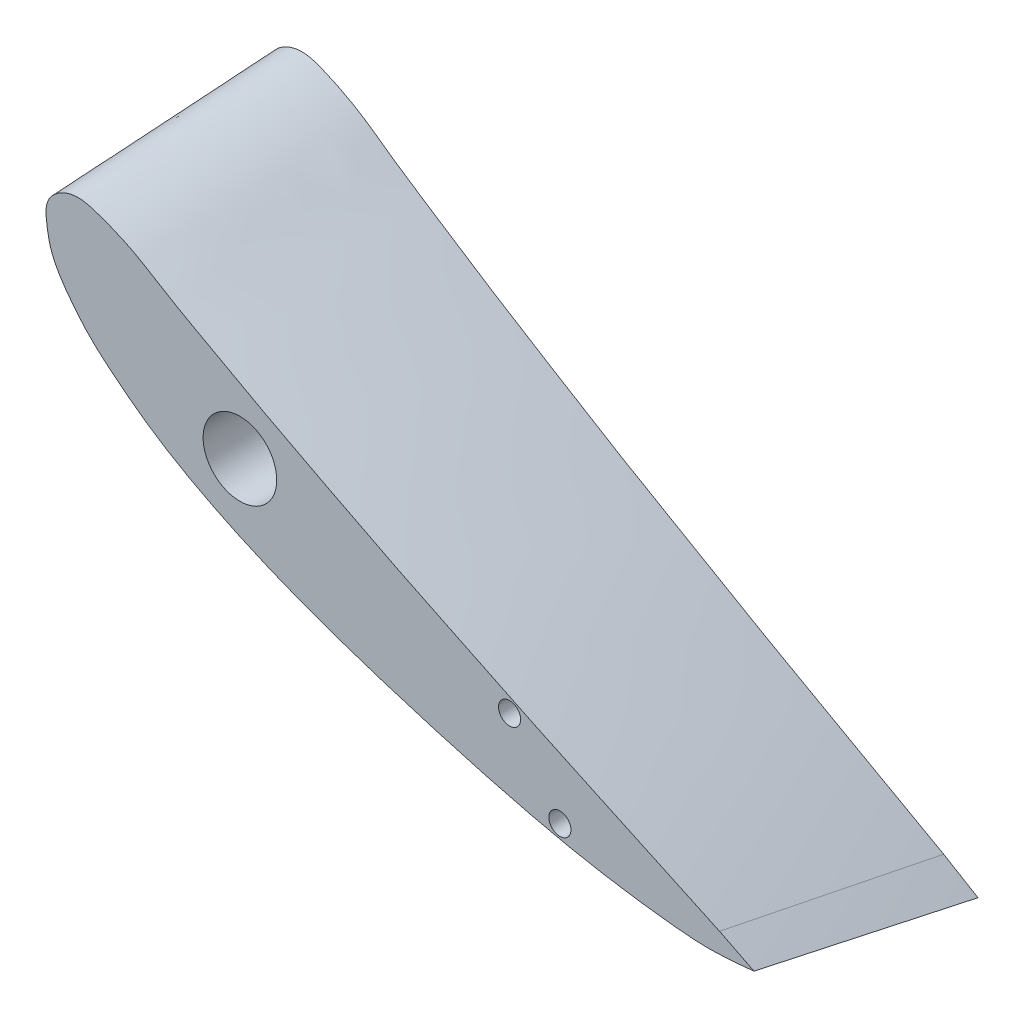
ISO-10303-21;
HEADER;
FILE_DESCRIPTION(('STEP AP214'),'2;1');
FILE_NAME('part.step','',(''),(''),'','','');
FILE_SCHEMA(('AUTOMOTIVE_DESIGN { 1 0 10303 214 1 1 1 1 }'));
ENDSEC;
DATA;
#1=APPLICATION_CONTEXT('core data for automotive mechanical design processes');
#2=APPLICATION_PROTOCOL_DEFINITION('international standard','automotive_design',2000,#1);
#3=PRODUCT_CONTEXT('',#1,'mechanical');
#4=PRODUCT('Part','Part','',(#3));
#5=PRODUCT_RELATED_PRODUCT_CATEGORY('part','',(#4));
#6=PRODUCT_DEFINITION_FORMATION('','',#4);
#7=PRODUCT_DEFINITION_CONTEXT('part definition',#1,'design');
#8=PRODUCT_DEFINITION('design','',#6,#7);
#9=PRODUCT_DEFINITION_SHAPE('','',#8);
#10=(LENGTH_UNIT() NAMED_UNIT(*) SI_UNIT(.MILLI.,.METRE.));
#11=(NAMED_UNIT(*) PLANE_ANGLE_UNIT() SI_UNIT($,.RADIAN.));
#12=(NAMED_UNIT(*) SI_UNIT($,.STERADIAN.) SOLID_ANGLE_UNIT());
#13=UNCERTAINTY_MEASURE_WITH_UNIT(LENGTH_MEASURE(1.E-05),#10,'distance_accuracy_value','');
#14=(GEOMETRIC_REPRESENTATION_CONTEXT(3) GLOBAL_UNCERTAINTY_ASSIGNED_CONTEXT((#13)) GLOBAL_UNIT_ASSIGNED_CONTEXT((#10,
#11,#12)) REPRESENTATION_CONTEXT('',''));
#15=CARTESIAN_POINT('',(0.,0.,0.));
#16=DIRECTION('',(0.,0.,1.));
#17=DIRECTION('',(1.,0.,0.));
#18=AXIS2_PLACEMENT_3D('',#15,#16,#17);
#19=CARTESIAN_POINT('',(-25.789086185669,14.9556146012437,-30.));
#20=DIRECTION('',(0.,0.,1.));
#21=DIRECTION('',(1.,0.,0.));
#22=AXIS2_PLACEMENT_3D('',#19,#20,#21);
#23=PLANE('',#22);
#24=CARTESIAN_POINT('',(43.4541338442568,-21.1786975584337,-30.));
#25=DIRECTION('',(0.,0.,1.));
#26=DIRECTION('',(1.,0.,0.));
#27=AXIS2_PLACEMENT_3D('',#24,#25,#26);
#28=CIRCLE('',#27,1.5);
#29=CARTESIAN_POINT('',(44.9541338442568,-21.1786975584337,-30.));
#30=VERTEX_POINT('',#29);
#31=EDGE_CURVE('E93',#30,#30,#28,.T.);
#32=ORIENTED_EDGE('',*,*,#31,.T.);
#33=EDGE_LOOP('',(#32));
#34=FACE_BOUND('',#33,.T.);
#35=CARTESIAN_POINT('',(0.,0.,-30.));
#36=DIRECTION('',(0.,0.,1.));
#37=DIRECTION('',(1.,0.,0.));
#38=AXIS2_PLACEMENT_3D('',#35,#36,#37);
#39=CIRCLE('',#38,5.);
#40=CARTESIAN_POINT('',(5.,0.,-30.));
#41=VERTEX_POINT('',#40);
#42=EDGE_CURVE('E87',#41,#41,#39,.T.);
#43=ORIENTED_EDGE('',*,*,#42,.T.);
#44=EDGE_LOOP('',(#43));
#45=FACE_BOUND('',#44,.T.);
#46=CARTESIAN_POINT('',(65.5739573309162,-28.7173000329715,-30.));
#47=CARTESIAN_POINT('',(63.9918671686072,-27.8349277479633,-30.));
#48=CARTESIAN_POINT('',(59.2455966816811,-25.1878108929409,-30.));
#49=CARTESIAN_POINT('',(51.3437752224579,-20.760804430331,-30.));
#50=CARTESIAN_POINT('',(41.8212332738992,-15.5216786302253,-30.));
#51=CARTESIAN_POINT('',(32.451573198761,-10.0166902311277,-30.));
#52=CARTESIAN_POINT('',(22.9978035086664,-4.65932332355163,-30.));
#53=CARTESIAN_POINT('',(13.7339171348711,1.01907601010571,-30.));
#54=CARTESIAN_POINT('',(4.46014511403473,6.68522792284203,-30.));
#55=CARTESIAN_POINT('',(-3.1163251148217,11.649820016503,-30.));
#56=CARTESIAN_POINT('',(-9.19968968461705,15.6004231292486,-30.));
#57=CARTESIAN_POINT('',(-12.8112327854822,18.350917021048,-30.));
#58=CARTESIAN_POINT('',(-15.9772082035379,20.1522075245231,-30.));
#59=CARTESIAN_POINT('',(-18.4533482644197,21.3154772066417,-30.));
#60=CARTESIAN_POINT('',(-20.762793568469,22.1913051711168,-30.));
#61=CARTESIAN_POINT('',(-23.4288771253178,21.973521547609,-30.));
#62=CARTESIAN_POINT('',(-26.1920224533883,20.1678634281628,-30.));
#63=CARTESIAN_POINT('',(-26.0279498835935,16.9247634703913,-30.));
#64=CARTESIAN_POINT('',(-25.7270913097616,14.0159930804658,-30.));
#65=CARTESIAN_POINT('',(-24.5875381711682,11.310822760205,-30.));
#66=CARTESIAN_POINT('',(-22.8874158808214,8.66710964588079,-30.));
#67=CARTESIAN_POINT('',(-20.621339251034,5.50823343889777,-30.));
#68=CARTESIAN_POINT('',(-17.2425748661609,2.21739668139687,-30.));
#69=CARTESIAN_POINT('',(-11.7458272294005,-2.65358908625349,-30.));
#70=CARTESIAN_POINT('',(-4.11944039800331,-7.67765410393565,-30.));
#71=CARTESIAN_POINT('',(5.49281733100073,-12.8300562141478,-30.));
#72=CARTESIAN_POINT('',(15.5256591856785,-17.2208229925941,-30.));
#73=CARTESIAN_POINT('',(25.7758132919287,-21.2449034680802,-30.));
#74=CARTESIAN_POINT('',(36.2247609840777,-24.982169981968,-30.));
#75=CARTESIAN_POINT('',(46.9717313450525,-28.3127863745016,-30.));
#76=CARTESIAN_POINT('',(56.25769656678,-30.3625387372331,-30.));
#77=CARTESIAN_POINT('',(64.054362221775,-31.6748637365026,-30.));
#78=CARTESIAN_POINT('',(68.1295713384236,-31.562670126222,-30.));
#79=CARTESIAN_POINT('',(70.2363948767859,-31.5046676698508,-30.));
#80=B_SPLINE_CURVE_WITH_KNOTS('',3,(#46,#47,#48,#49,#50,#51,#52,#53,#54,#55,#56,#57,#58,#59,#60,
#61,#62,#63,#64,#65,#66,#67,#68,#69,#70,#71,#72,#73,#74,#75,#76,#77,#78,#79),.UNSPECIFIED.,.F.,
.F.,(4,1,1,1,1,1,1,1,1,1,1,1,1,1,1,1,1,1,1,1,1,1,1,1,1,1,1,1,1,1,1,4),(0.,0.024539223239315,
0.0736176697179449,0.122696116196575,0.171758102468826,0.220820088741077,0.269879113320182,
0.318936693489756,0.368025361597795,0.392583028094628,0.417173001250673,0.429440472758663,
0.441764658743505,0.454461371263475,0.461994015532278,0.477712656864197,0.492780517083889,
0.502278122505289,0.517831839222446,0.531656069899839,0.544957030128068,0.57036121074101,
0.595284183630096,0.644429948946362,0.693535769444944,0.742943262592495,0.792666042354747,
0.842690657547491,0.893260265870848,0.94491578158227,0.971522264346957,1.),.UNSPECIFIED.);
#81=CARTESIAN_POINT('',(65.5739573309162,-28.7173000329715,-30.));
#82=VERTEX_POINT('',#81);
#83=CARTESIAN_POINT('',(70.2363948767859,-31.5046676698508,-30.));
#84=VERTEX_POINT('',#83);
#85=EDGE_CURVE('E64',#82,#84,#80,.T.);
#86=ORIENTED_EDGE('',*,*,#85,.F.);
#87=DIRECTION('',(-0.858311708800499,0.513128649108552,0.));
#88=VECTOR('',#87,1.);
#89=CARTESIAN_POINT('',(65.5739573309162,-28.7173000329715,-30.));
#90=LINE('',#89,#88);
#91=EDGE_CURVE('E38',#84,#82,#90,.T.);
#92=ORIENTED_EDGE('',*,*,#91,.F.);
#93=EDGE_LOOP('',(#86,#92));
#94=FACE_BOUND('',#93,.T.);
#95=ADVANCED_FACE('F35',(#34,#45,#94),#23,.F.);
#96=CARTESIAN_POINT('',(-25.8751677995834,12.5690081194773,0.));
#97=DIRECTION('',(0.,0.,1.));
#98=DIRECTION('',(1.,0.,0.));
#99=AXIS2_PLACEMENT_3D('',#96,#97,#98);
#100=PLANE('',#99);
#101=CARTESIAN_POINT('',(43.4541338442568,-21.1786975584337,0.));
#102=DIRECTION('',(0.,0.,1.));
#103=DIRECTION('',(1.,0.,0.));
#104=AXIS2_PLACEMENT_3D('',#101,#102,#103);
#105=CIRCLE('',#104,1.5);
#106=CARTESIAN_POINT('',(44.9541338442568,-21.1786975584337,0.));
#107=VERTEX_POINT('',#106);
#108=EDGE_CURVE('E96',#107,#107,#105,.T.);
#109=ORIENTED_EDGE('',*,*,#108,.F.);
#110=EDGE_LOOP('',(#109));
#111=FACE_BOUND('',#110,.T.);
#112=CARTESIAN_POINT('',(0.,0.,0.));
#113=DIRECTION('',(0.,0.,1.));
#114=DIRECTION('',(1.,0.,0.));
#115=AXIS2_PLACEMENT_3D('',#112,#113,#114);
#116=CIRCLE('',#115,5.);
#117=CARTESIAN_POINT('',(5.,0.,0.));
#118=VERTEX_POINT('',#117);
#119=EDGE_CURVE('E90',#118,#118,#116,.T.);
#120=ORIENTED_EDGE('',*,*,#119,.F.);
#121=EDGE_LOOP('',(#120));
#122=FACE_BOUND('',#121,.T.);
#123=CARTESIAN_POINT('',(36.622171624693,-11.6170764544321,0.));
#124=DIRECTION('',(0.,0.,1.));
#125=DIRECTION('',(1.,0.,0.));
#126=AXIS2_PLACEMENT_3D('',#123,#124,#125);
#127=CIRCLE('',#126,1.5);
#128=CARTESIAN_POINT('',(38.122171624693,-11.6170764544321,0.));
#129=VERTEX_POINT('',#128);
#130=EDGE_CURVE('E81',#129,#129,#127,.T.);
#131=ORIENTED_EDGE('',*,*,#130,.F.);
#132=EDGE_LOOP('',(#131));
#133=FACE_BOUND('',#132,.T.);
#134=CARTESIAN_POINT('',(65.134579844463,-22.9995309699649,0.));
#135=CARTESIAN_POINT('',(63.5496914173049,-22.2622479812306,0.));
#136=CARTESIAN_POINT('',(58.7950261358319,-20.0503990150295,0.));
#137=CARTESIAN_POINT('',(50.8778175646714,-16.3487993381326,0.));
#138=CARTESIAN_POINT('',(41.343512177954,-11.9802548823201,0.));
#139=CARTESIAN_POINT('',(31.9375337278064,-7.34505211960584,0.));
#140=CARTESIAN_POINT('',(22.4610505783409,-2.85785760789748,0.));
#141=CARTESIAN_POINT('',(13.1446016186923,1.95170321629111,0.));
#142=CARTESIAN_POINT('',(3.81950525001302,6.74877896799742,0.));
#143=CARTESIAN_POINT('',(-3.8226140362771,10.9907198333955,0.));
#144=CARTESIAN_POINT('',(-9.95617244202911,14.3624267984176,0.));
#145=CARTESIAN_POINT('',(-13.6261568834983,16.7539862442742,0.));
#146=CARTESIAN_POINT('',(-16.8002450756207,18.2635947971804,0.));
#147=CARTESIAN_POINT('',(-19.2653703672842,19.2079849467583,0.));
#148=CARTESIAN_POINT('',(-21.5497566138504,19.8875449709311,0.));
#149=CARTESIAN_POINT('',(-24.1000289050709,19.4894676075075,0.));
#150=CARTESIAN_POINT('',(-26.6314421320634,17.5564579994679,0.));
#151=CARTESIAN_POINT('',(-26.2442569390299,14.4471042220962,0.));
#152=CARTESIAN_POINT('',(-25.7490751742995,11.6691590226266,0.));
#153=CARTESIAN_POINT('',(-24.4611817263747,9.14644262598379,0.));
#154=CARTESIAN_POINT('',(-22.6381771557667,6.72250185075357,0.));
#155=CARTESIAN_POINT('',(-20.2341111587322,3.84281458955476,0.));
#156=CARTESIAN_POINT('',(-16.7499351377333,0.91480558609965,0.));
#157=CARTESIAN_POINT('',(-11.1158272416026,-3.38409406051229,0.));
#158=CARTESIAN_POINT('',(-3.42146655205404,-7.67973872015558,0.));
#159=CARTESIAN_POINT('',(6.19304412057203,-11.958482747073,0.));
#160=CARTESIAN_POINT('',(16.158449526063,-15.4745412344294,0.));
#161=CARTESIAN_POINT('',(26.3070571919711,-18.6223597423882,0.));
#162=CARTESIAN_POINT('',(36.6266930246887,-21.4801116507225,0.));
#163=CARTESIAN_POINT('',(47.2043762073488,-23.9254585820161,0.));
#164=CARTESIAN_POINT('',(56.2855215406593,-25.2414784154929,0.));
#165=CARTESIAN_POINT('',(63.881322066473,-25.9531406334147,0.));
#166=CARTESIAN_POINT('',(67.7951129091131,-25.557049069806,0.));
#167=CARTESIAN_POINT('',(69.8184855595655,-25.3522755218309,0.));
#168=B_SPLINE_CURVE_WITH_KNOTS('',3,(#134,#135,#136,#137,#138,#139,#140,#141,#142,#143,#144,
#145,#146,#147,#148,#149,#150,#151,#152,#153,#154,#155,#156,#157,#158,#159,#160,#161,#162,#163,
#164,#165,#166,#167),.UNSPECIFIED.,.F.,.F.,(4,1,1,1,1,1,1,1,1,1,1,1,1,1,1,1,1,1,1,1,1,1,1,1,1,1,
1,1,1,1,1,4),(0.,0.024539223239315,0.0736176697179449,0.122696116196575,0.171758102468826,
0.220820088741077,0.269879113320182,0.318936693489756,0.368025361597795,0.392583028094628,
0.417173001250673,0.429440472758663,0.441764658743505,0.454461371263475,0.461994015532278,
0.477712656864197,0.492780517083889,0.502278122505289,0.517831839222446,0.531656069899839,
0.544957030128068,0.57036121074101,0.595284183630096,0.644429948946362,0.693535769444944,
0.742943262592495,0.792666042354747,0.842690657547491,0.893260265870848,0.94491578158227,
0.971522264346957,1.),.UNSPECIFIED.);
#169=CARTESIAN_POINT('',(65.134579844463,-22.9995309699649,0.));
#170=VERTEX_POINT('',#169);
#171=CARTESIAN_POINT('',(69.8184855595655,-25.3522755218309,0.));
#172=VERTEX_POINT('',#171);
#173=EDGE_CURVE('E44',#170,#172,#168,.T.);
#174=ORIENTED_EDGE('',*,*,#173,.T.);
#175=DIRECTION('',(-0.893602132590605,0.448859920943631,0.));
#176=VECTOR('',#175,1.);
#177=CARTESIAN_POINT('',(65.134579844463,-22.9995309699649,0.));
#178=LINE('',#177,#176);
#179=EDGE_CURVE('E11',#172,#170,#178,.T.);
#180=ORIENTED_EDGE('',*,*,#179,.T.);
#181=EDGE_LOOP('',(#174,#180));
#182=FACE_BOUND('',#181,.T.);
#183=ADVANCED_FACE('F111',(#111,#122,#133,#182),#100,.T.);
#184=CARTESIAN_POINT('',(69.8184855595655,-25.3522755218309,0.));
#185=CARTESIAN_POINT('',(70.2363948767859,-31.5046676698508,-30.));
#186=CARTESIAN_POINT('',(67.7951129091131,-25.557049069806,0.));
#187=CARTESIAN_POINT('',(68.1295713384236,-31.562670126222,-30.));
#188=CARTESIAN_POINT('',(63.881322066473,-25.9531406334147,0.));
#189=CARTESIAN_POINT('',(64.054362221775,-31.6748637365026,-30.));
#190=CARTESIAN_POINT('',(56.2855215406593,-25.2414784154929,0.));
#191=CARTESIAN_POINT('',(56.25769656678,-30.3625387372331,-30.));
#192=CARTESIAN_POINT('',(47.2043762073488,-23.9254585820161,0.));
#193=CARTESIAN_POINT('',(46.9717313450525,-28.3127863745016,-30.));
#194=CARTESIAN_POINT('',(36.6266930246887,-21.4801116507225,0.));
#195=CARTESIAN_POINT('',(36.2247609840777,-24.982169981968,-30.));
#196=CARTESIAN_POINT('',(26.3070571919711,-18.6223597423882,0.));
#197=CARTESIAN_POINT('',(25.7758132919287,-21.2449034680802,-30.));
#198=CARTESIAN_POINT('',(16.158449526063,-15.4745412344294,0.));
#199=CARTESIAN_POINT('',(15.5256591856785,-17.2208229925941,-30.));
#200=CARTESIAN_POINT('',(6.19304412057203,-11.958482747073,0.));
#201=CARTESIAN_POINT('',(5.49281733100073,-12.8300562141478,-30.));
#202=CARTESIAN_POINT('',(-3.42146655205404,-7.67973872015558,0.));
#203=CARTESIAN_POINT('',(-4.11944039800331,-7.67765410393565,-30.));
#204=CARTESIAN_POINT('',(-11.1158272416026,-3.38409406051229,0.));
#205=CARTESIAN_POINT('',(-11.7458272294005,-2.65358908625349,-30.));
#206=CARTESIAN_POINT('',(-16.7499351377333,0.91480558609965,0.));
#207=CARTESIAN_POINT('',(-17.2425748661609,2.21739668139687,-30.));
#208=CARTESIAN_POINT('',(-20.2341111587322,3.84281458955476,0.));
#209=CARTESIAN_POINT('',(-20.621339251034,5.50823343889777,-30.));
#210=CARTESIAN_POINT('',(-22.6381771557667,6.72250185075357,0.));
#211=CARTESIAN_POINT('',(-22.8874158808214,8.66710964588079,-30.));
#212=CARTESIAN_POINT('',(-24.4611817263747,9.14644262598379,0.));
#213=CARTESIAN_POINT('',(-24.5875381711682,11.310822760205,-30.));
#214=CARTESIAN_POINT('',(-25.7490751742995,11.6691590226266,0.));
#215=CARTESIAN_POINT('',(-25.7270913097616,14.0159930804658,-30.));
#216=CARTESIAN_POINT('',(-26.2442569390299,14.4471042220962,0.));
#217=CARTESIAN_POINT('',(-26.0279498835935,16.9247634703913,-30.));
#218=CARTESIAN_POINT('',(-26.6314421320634,17.5564579994679,0.));
#219=CARTESIAN_POINT('',(-26.1920224533883,20.1678634281628,-30.));
#220=CARTESIAN_POINT('',(-24.1000289050709,19.4894676075075,0.));
#221=CARTESIAN_POINT('',(-23.4288771253178,21.973521547609,-30.));
#222=CARTESIAN_POINT('',(-21.5497566138504,19.8875449709311,0.));
#223=CARTESIAN_POINT('',(-20.762793568469,22.1913051711168,-30.));
#224=CARTESIAN_POINT('',(-19.2653703672842,19.2079849467583,0.));
#225=CARTESIAN_POINT('',(-18.4533482644197,21.3154772066417,-30.));
#226=CARTESIAN_POINT('',(-16.8002450756207,18.2635947971804,0.));
#227=CARTESIAN_POINT('',(-15.9772082035379,20.1522075245231,-30.));
#228=CARTESIAN_POINT('',(-13.6261568834983,16.7539862442742,0.));
#229=CARTESIAN_POINT('',(-12.8112327854822,18.350917021048,-30.));
#230=CARTESIAN_POINT('',(-9.95617244202911,14.3624267984176,0.));
#231=CARTESIAN_POINT('',(-9.19968968461705,15.6004231292486,-30.));
#232=CARTESIAN_POINT('',(-3.8226140362771,10.9907198333955,0.));
#233=CARTESIAN_POINT('',(-3.1163251148217,11.649820016503,-30.));
#234=CARTESIAN_POINT('',(3.81950525001302,6.74877896799742,0.));
#235=CARTESIAN_POINT('',(4.46014511403473,6.68522792284203,-30.));
#236=CARTESIAN_POINT('',(13.1446016186923,1.95170321629111,0.));
#237=CARTESIAN_POINT('',(13.7339171348711,1.01907601010571,-30.));
#238=CARTESIAN_POINT('',(22.4610505783409,-2.85785760789748,0.));
#239=CARTESIAN_POINT('',(22.9978035086664,-4.65932332355163,-30.));
#240=CARTESIAN_POINT('',(31.9375337278064,-7.34505211960584,0.));
#241=CARTESIAN_POINT('',(32.451573198761,-10.0166902311277,-30.));
#242=CARTESIAN_POINT('',(41.343512177954,-11.9802548823201,0.));
#243=CARTESIAN_POINT('',(41.8212332738992,-15.5216786302253,-30.));
#244=CARTESIAN_POINT('',(50.8778175646714,-16.3487993381326,0.));
#245=CARTESIAN_POINT('',(51.3437752224579,-20.760804430331,-30.));
#246=CARTESIAN_POINT('',(58.7950261358319,-20.0503990150295,0.));
#247=CARTESIAN_POINT('',(59.2455966816811,-25.1878108929409,-30.));
#248=CARTESIAN_POINT('',(63.5496914173049,-22.2622479812306,0.));
#249=CARTESIAN_POINT('',(63.9918671686072,-27.8349277479633,-30.));
#250=CARTESIAN_POINT('',(65.134579844463,-22.9995309699649,0.));
#251=CARTESIAN_POINT('',(65.5739573309162,-28.7173000329715,-30.));
#252=B_SPLINE_SURFACE_WITH_KNOTS('',3,1,((#184,#185),(#186,#187),(#188,#189),(#190,#191),(#192,
#193),(#194,#195),(#196,#197),(#198,#199),(#200,#201),(#202,#203),(#204,#205),(#206,#207),(#208,
#209),(#210,#211),(#212,#213),(#214,#215),(#216,#217),(#218,#219),(#220,#221),(#222,#223),(#224,
#225),(#226,#227),(#228,#229),(#230,#231),(#232,#233),(#234,#235),(#236,#237),(#238,#239),(#240,
#241),(#242,#243),(#244,#245),(#246,#247),(#248,#249),(#250,#251)),.UNSPECIFIED.,.F.,.F.,.F.,(4,
1,1,1,1,1,1,1,1,1,1,1,1,1,1,1,1,1,1,1,1,1,1,1,1,1,1,1,1,1,1,4),(2,2),(0.,0.0284777356530428,
0.05508421841773,0.106739734129152,0.157309342452509,0.207333957645253,0.257056737407505,
0.306464230555056,0.355570051053638,0.404715816369904,0.42963878925899,0.455042969871932,
0.468343930100161,0.482168160777554,0.497721877494711,0.507219482916111,0.522287343135803,
0.538005984467722,0.545538628736525,0.558235341256495,0.570559527241337,0.582826998749327,
0.607416971905372,0.631974638402205,0.681063306510244,0.730120886679818,0.779179911258923,
0.828241897531174,0.877303883803425,0.926382330282055,0.975460776760685,1.),(0.,1.),.UNSPECIFIED.);
#253=DIRECTION('',(0.0143854524969163,-0.187202798914867,-0.982215949185768));
#254=VECTOR('',#253,1.);
#255=CARTESIAN_POINT('',(65.3542685876896,-25.8584155014682,-15.));
#256=LINE('',#255,#254);
#257=EDGE_CURVE('E59',#170,#82,#256,.T.);
#258=DIRECTION('',(-0.0136450295967407,0.200879878699172,0.97952084587369));
#259=VECTOR('',#258,1.);
#260=CARTESIAN_POINT('',(70.0274402181757,-28.4284715958409,-15.));
#261=LINE('',#260,#259);
#262=EDGE_CURVE('E53',#84,#172,#261,.T.);
#263=ORIENTED_EDGE('',*,*,#173,.F.);
#264=ORIENTED_EDGE('',*,*,#257,.T.);
#265=ORIENTED_EDGE('',*,*,#85,.T.);
#266=ORIENTED_EDGE('',*,*,#262,.T.);
#267=EDGE_LOOP('',(#263,#264,#265,#266));
#268=FACE_BOUND('',#267,.T.);
#269=ADVANCED_FACE('F66',(#268),#252,.T.);
#270=CARTESIAN_POINT('',(65.134579844463,-22.9995309699649,0.));
#271=CARTESIAN_POINT('',(65.5739573309162,-28.7173000329715,-30.));
#272=CARTESIAN_POINT('',(65.91523079698,-23.3916550619426,0.));
#273=CARTESIAN_POINT('',(66.3510302552278,-29.1818613057847,-30.));
#274=CARTESIAN_POINT('',(66.6958817494971,-23.7837791539202,0.));
#275=CARTESIAN_POINT('',(67.1281031795395,-29.6464225785979,-30.));
#276=CARTESIAN_POINT('',(68.2571836545313,-24.5680273378755,0.));
#277=CARTESIAN_POINT('',(68.6822490281627,-30.5755451242244,-30.));
#278=CARTESIAN_POINT('',(69.0378346070484,-24.9601514298532,0.));
#279=CARTESIAN_POINT('',(69.4593219524743,-31.0401063970376,-30.));
#280=CARTESIAN_POINT('',(69.8184855595655,-25.3522755218309,0.));
#281=CARTESIAN_POINT('',(70.2363948767859,-31.5046676698508,-30.));
#282=B_SPLINE_SURFACE_WITH_KNOTS('',3,1,((#270,#271),(#272,#273),(#274,#275),(#276,#277),(#278,
#279),(#280,#281)),.UNSPECIFIED.,.F.,.F.,.F.,(4,2,4),(2,2),(0.,0.5,1.),(0.,1.),.UNSPECIFIED.);
#283=ORIENTED_EDGE('',*,*,#179,.F.);
#284=ORIENTED_EDGE('',*,*,#262,.F.);
#285=ORIENTED_EDGE('',*,*,#91,.T.);
#286=ORIENTED_EDGE('',*,*,#257,.F.);
#287=EDGE_LOOP('',(#283,#284,#285,#286));
#288=FACE_BOUND('',#287,.T.);
#289=ADVANCED_FACE('F68',(#288),#282,.T.);
#290=CARTESIAN_POINT('',(36.622171624693,-11.6170764544321,-2.5));
#291=DIRECTION('',(0.,0.,1.));
#292=DIRECTION('',(1.,0.,0.));
#293=AXIS2_PLACEMENT_3D('',#290,#291,#292);
#294=CYLINDRICAL_SURFACE('',#293,1.5);
#295=CARTESIAN_POINT('',(36.622171624693,-11.6170764544321,-2.5));
#296=DIRECTION('',(0.,0.,1.));
#297=DIRECTION('',(1.,0.,0.));
#298=AXIS2_PLACEMENT_3D('',#295,#296,#297);
#299=CIRCLE('',#298,1.5);
#300=CARTESIAN_POINT('',(38.122171624693,-11.6170764544321,-2.5));
#301=VERTEX_POINT('',#300);
#302=EDGE_CURVE('E67',#301,#301,#299,.T.);
#303=ORIENTED_EDGE('',*,*,#302,.F.);
#304=EDGE_LOOP('',(#303));
#305=FACE_BOUND('',#304,.T.);
#306=ORIENTED_EDGE('',*,*,#130,.T.);
#307=EDGE_LOOP('',(#306));
#308=FACE_BOUND('',#307,.T.);
#309=ADVANCED_FACE('F120',(#305,#308),#294,.F.);
#310=CARTESIAN_POINT('',(36.622171624693,-11.6170764544321,-2.5));
#311=DIRECTION('',(0.,0.,1.));
#312=DIRECTION('',(1.,0.,0.));
#313=AXIS2_PLACEMENT_3D('',#310,#311,#312);
#314=PLANE('',#313);
#315=ORIENTED_EDGE('',*,*,#302,.T.);
#316=EDGE_LOOP('',(#315));
#317=FACE_BOUND('',#316,.T.);
#318=ADVANCED_FACE('F122',(#317),#314,.T.);
#319=CARTESIAN_POINT('',(0.,0.,-30.));
#320=DIRECTION('',(0.,0.,1.));
#321=DIRECTION('',(1.,0.,0.));
#322=AXIS2_PLACEMENT_3D('',#319,#320,#321);
#323=CYLINDRICAL_SURFACE('',#322,5.);
#324=ORIENTED_EDGE('',*,*,#42,.F.);
#325=EDGE_LOOP('',(#324));
#326=FACE_BOUND('',#325,.T.);
#327=ORIENTED_EDGE('',*,*,#119,.T.);
#328=EDGE_LOOP('',(#327));
#329=FACE_BOUND('',#328,.T.);
#330=ADVANCED_FACE('F107',(#326,#329),#323,.F.);
#331=CARTESIAN_POINT('',(43.4541338442568,-21.1786975584337,-30.));
#332=DIRECTION('',(0.,0.,1.));
#333=DIRECTION('',(1.,0.,0.));
#334=AXIS2_PLACEMENT_3D('',#331,#332,#333);
#335=CYLINDRICAL_SURFACE('',#334,1.5);
#336=ORIENTED_EDGE('',*,*,#31,.F.);
#337=EDGE_LOOP('',(#336));
#338=FACE_BOUND('',#337,.T.);
#339=ORIENTED_EDGE('',*,*,#108,.T.);
#340=EDGE_LOOP('',(#339));
#341=FACE_BOUND('',#340,.T.);
#342=ADVANCED_FACE('F104',(#338,#341),#335,.F.);
#343=CLOSED_SHELL('',(#95,#183,#269,#289,#309,#318,#330,#342));
#344=MANIFOLD_SOLID_BREP('B2',#343);
#345=ADVANCED_BREP_SHAPE_REPRESENTATION('',(#18,#344),#14);
#346=SHAPE_DEFINITION_REPRESENTATION(#9,#345);
ENDSEC;
END-ISO-10303-21;
